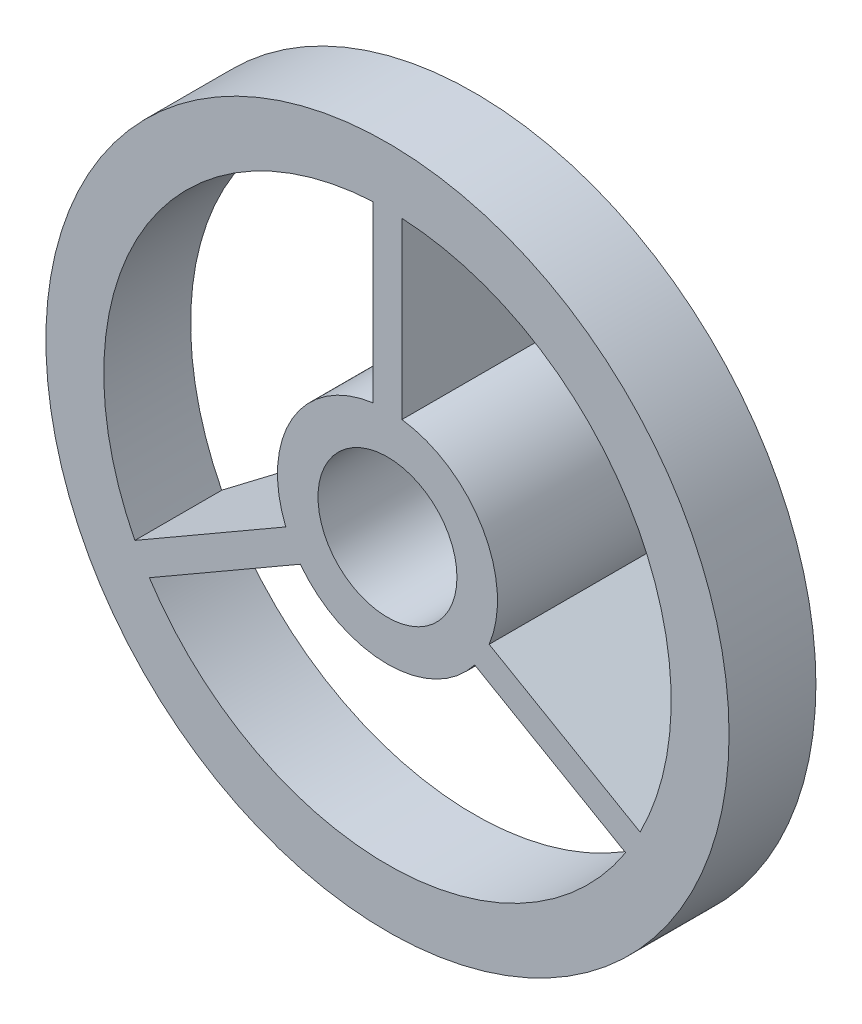
ISO-10303-21;
HEADER;
FILE_DESCRIPTION(('STEP AP214'),'2;1');
FILE_NAME('part.step','',(''),(''),'','','');
FILE_SCHEMA(('AUTOMOTIVE_DESIGN { 1 0 10303 214 1 1 1 1 }'));
ENDSEC;
DATA;
#1=APPLICATION_CONTEXT('core data for automotive mechanical design processes');
#2=APPLICATION_PROTOCOL_DEFINITION('international standard','automotive_design',2000,#1);
#3=PRODUCT_CONTEXT('',#1,'mechanical');
#4=PRODUCT('Part','Part','',(#3));
#5=PRODUCT_RELATED_PRODUCT_CATEGORY('part','',(#4));
#6=PRODUCT_DEFINITION_FORMATION('','',#4);
#7=PRODUCT_DEFINITION_CONTEXT('part definition',#1,'design');
#8=PRODUCT_DEFINITION('design','',#6,#7);
#9=PRODUCT_DEFINITION_SHAPE('','',#8);
#10=(LENGTH_UNIT() NAMED_UNIT(*) SI_UNIT(.MILLI.,.METRE.));
#11=(NAMED_UNIT(*) PLANE_ANGLE_UNIT() SI_UNIT($,.RADIAN.));
#12=(NAMED_UNIT(*) SI_UNIT($,.STERADIAN.) SOLID_ANGLE_UNIT());
#13=UNCERTAINTY_MEASURE_WITH_UNIT(LENGTH_MEASURE(1.E-05),#10,'distance_accuracy_value','');
#14=(GEOMETRIC_REPRESENTATION_CONTEXT(3) GLOBAL_UNCERTAINTY_ASSIGNED_CONTEXT((#13)) GLOBAL_UNIT_ASSIGNED_CONTEXT((#10,
#11,#12)) REPRESENTATION_CONTEXT('',''));
#15=CARTESIAN_POINT('',(0.,0.,0.));
#16=DIRECTION('',(0.,0.,1.));
#17=DIRECTION('',(1.,0.,0.));
#18=AXIS2_PLACEMENT_3D('',#15,#16,#17);
#19=CARTESIAN_POINT('',(0.,0.,3.5));
#20=DIRECTION('',(0.,0.,-1.));
#21=DIRECTION('',(-1.,0.,0.));
#22=AXIS2_PLACEMENT_3D('',#19,#20,#21);
#23=CYLINDRICAL_SURFACE('',#22,1.9);
#24=DIRECTION('',(0.,0.,-1.));
#25=VECTOR('',#24,1.);
#26=CARTESIAN_POINT('',(1.75614223781987,-0.725234059145742,3.5));
#27=LINE('',#26,#25);
#28=CARTESIAN_POINT('',(1.75614223781987,-0.725234059145742,0.));
#29=VERTEX_POINT('',#28);
#30=CARTESIAN_POINT('',(1.75614223781987,-0.725234059145742,3.5));
#31=VERTEX_POINT('',#30);
#32=EDGE_CURVE('E198',#29,#31,#27,.F.);
#33=ORIENTED_EDGE('',*,*,#32,.F.);
#34=CARTESIAN_POINT('',(0.,0.,0.));
#35=DIRECTION('',(0.,0.,1.));
#36=DIRECTION('',(1.,0.,0.));
#37=AXIS2_PLACEMENT_3D('',#34,#35,#36);
#38=CIRCLE('',#37,1.9);
#39=CARTESIAN_POINT('',(0.25,1.88348082018374,0.));
#40=VERTEX_POINT('',#39);
#41=EDGE_CURVE('E287',#29,#40,#38,.T.);
#42=ORIENTED_EDGE('',*,*,#41,.T.);
#43=DIRECTION('',(0.,0.,-1.));
#44=VECTOR('',#43,1.);
#45=CARTESIAN_POINT('',(0.25,1.88348082018374,3.5));
#46=LINE('',#45,#44);
#47=CARTESIAN_POINT('',(0.25,1.88348082018374,3.5));
#48=VERTEX_POINT('',#47);
#49=EDGE_CURVE('E301',#40,#48,#46,.F.);
#50=ORIENTED_EDGE('',*,*,#49,.T.);
#51=CARTESIAN_POINT('',(0.,0.,3.5));
#52=DIRECTION('',(0.,0.,1.));
#53=DIRECTION('',(1.,0.,0.));
#54=AXIS2_PLACEMENT_3D('',#51,#52,#53);
#55=CIRCLE('',#54,1.9);
#56=EDGE_CURVE('E295',#31,#48,#55,.T.);
#57=ORIENTED_EDGE('',*,*,#56,.F.);
#58=EDGE_LOOP('',(#33,#42,#50,#57));
#59=FACE_BOUND('',#58,.T.);
#60=ADVANCED_FACE('F37',(#59),#23,.T.);
#61=CARTESIAN_POINT('',(0.,0.,2.));
#62=DIRECTION('',(0.,0.,1.));
#63=DIRECTION('',(1.,0.,0.));
#64=AXIS2_PLACEMENT_3D('',#61,#62,#63);
#65=PLANE('',#64);
#66=CARTESIAN_POINT('',(0.,0.,2.));
#67=DIRECTION('',(0.,0.,1.));
#68=DIRECTION('',(1.,0.,0.));
#69=AXIS2_PLACEMENT_3D('',#66,#67,#68);
#70=CIRCLE('',#69,5.9);
#71=CARTESIAN_POINT('',(5.9,0.,2.));
#72=VERTEX_POINT('',#71);
#73=EDGE_CURVE('E248',#72,#72,#70,.T.);
#74=ORIENTED_EDGE('',*,*,#73,.F.);
#75=EDGE_LOOP('',(#74));
#76=FACE_BOUND('',#75,.T.);
#77=CARTESIAN_POINT('',(0.,0.,2.));
#78=DIRECTION('',(0.,0.,1.));
#79=DIRECTION('',(1.,0.,0.));
#80=AXIS2_PLACEMENT_3D('',#77,#78,#79);
#81=CIRCLE('',#80,4.9);
#82=CARTESIAN_POINT('',(-4.11299775837599,-2.66331549756954,2.));
#83=VERTEX_POINT('',#82);
#84=CARTESIAN_POINT('',(4.11299775837602,-2.66331549756949,2.));
#85=VERTEX_POINT('',#84);
#86=EDGE_CURVE('E243',#83,#85,#81,.T.);
#87=ORIENTED_EDGE('',*,*,#86,.T.);
#88=DIRECTION('',(0.866025403784443,-0.499999999999992,0.));
#89=VECTOR('',#88,1.);
#90=CARTESIAN_POINT('',(-0.124999999999998,-0.216506350946111,2.));
#91=LINE('',#90,#89);
#92=CARTESIAN_POINT('',(4.11852447854377,-2.66650635094607,2.));
#93=VERTEX_POINT('',#92);
#94=EDGE_CURVE('E203',#85,#93,#91,.T.);
#95=ORIENTED_EDGE('',*,*,#94,.T.);
#96=DIRECTION('',(0.499999999999992,0.866025403784443,0.));
#97=VECTOR('',#96,1.);
#98=CARTESIAN_POINT('',(4.11852447854377,-2.66650635094607,2.));
#99=LINE('',#98,#97);
#100=CARTESIAN_POINT('',(4.36852447854377,-2.23349364905385,2.));
#101=VERTEX_POINT('',#100);
#102=EDGE_CURVE('E52',#93,#101,#99,.T.);
#103=ORIENTED_EDGE('',*,*,#102,.T.);
#104=DIRECTION('',(0.866025403784443,-0.499999999999992,0.));
#105=VECTOR('',#104,1.);
#106=CARTESIAN_POINT('',(0.124999999999998,0.216506350946111,2.));
#107=LINE('',#106,#105);
#108=CARTESIAN_POINT('',(4.36299775837602,-2.23030279567726,2.));
#109=VERTEX_POINT('',#108);
#110=EDGE_CURVE('E196',#109,#101,#107,.T.);
#111=ORIENTED_EDGE('',*,*,#110,.F.);
#112=CARTESIAN_POINT('',(0.25,4.89361829324683,2.));
#113=VERTEX_POINT('',#112);
#114=EDGE_CURVE('E244',#109,#113,#81,.T.);
#115=ORIENTED_EDGE('',*,*,#114,.T.);
#116=DIRECTION('',(0.,-1.,0.));
#117=VECTOR('',#116,1.);
#118=CARTESIAN_POINT('',(0.25,0.,2.));
#119=LINE('',#118,#117);
#120=CARTESIAN_POINT('',(0.25,4.9,2.));
#121=VERTEX_POINT('',#120);
#122=EDGE_CURVE('E258',#121,#113,#119,.T.);
#123=ORIENTED_EDGE('',*,*,#122,.F.);
#124=DIRECTION('',(-1.,0.,0.));
#125=VECTOR('',#124,1.);
#126=CARTESIAN_POINT('',(0.25,4.9,2.));
#127=LINE('',#126,#125);
#128=CARTESIAN_POINT('',(-0.25,4.9,2.));
#129=VERTEX_POINT('',#128);
#130=EDGE_CURVE('E273',#121,#129,#127,.T.);
#131=ORIENTED_EDGE('',*,*,#130,.T.);
#132=DIRECTION('',(0.,-1.,0.));
#133=VECTOR('',#132,1.);
#134=CARTESIAN_POINT('',(-0.25,0.,2.));
#135=LINE('',#134,#133);
#136=CARTESIAN_POINT('',(-0.25,4.89361829324683,2.));
#137=VERTEX_POINT('',#136);
#138=EDGE_CURVE('E261',#129,#137,#135,.T.);
#139=ORIENTED_EDGE('',*,*,#138,.T.);
#140=CARTESIAN_POINT('',(-4.36299775837599,-2.23030279567732,2.));
#141=VERTEX_POINT('',#140);
#142=EDGE_CURVE('E239',#137,#141,#81,.T.);
#143=ORIENTED_EDGE('',*,*,#142,.T.);
#144=DIRECTION('',(-0.866025403784436,-0.500000000000004,0.));
#145=VECTOR('',#144,1.);
#146=CARTESIAN_POINT('',(-0.125000000000001,0.216506350946109,2.));
#147=LINE('',#146,#145);
#148=CARTESIAN_POINT('',(-4.36852447854374,-2.23349364905391,2.));
#149=VERTEX_POINT('',#148);
#150=EDGE_CURVE('E233',#141,#149,#147,.T.);
#151=ORIENTED_EDGE('',*,*,#150,.T.);
#152=DIRECTION('',(0.500000000000004,-0.866025403784436,0.));
#153=VECTOR('',#152,1.);
#154=CARTESIAN_POINT('',(-4.36852447854374,-2.23349364905391,2.));
#155=LINE('',#154,#153);
#156=CARTESIAN_POINT('',(-4.11852447854374,-2.66650635094613,2.));
#157=VERTEX_POINT('',#156);
#158=EDGE_CURVE('E216',#149,#157,#155,.T.);
#159=ORIENTED_EDGE('',*,*,#158,.T.);
#160=DIRECTION('',(-0.866025403784436,-0.500000000000004,0.));
#161=VECTOR('',#160,1.);
#162=CARTESIAN_POINT('',(0.125000000000001,-0.216506350946109,2.));
#163=LINE('',#162,#161);
#164=EDGE_CURVE('E227',#83,#157,#163,.T.);
#165=ORIENTED_EDGE('',*,*,#164,.F.);
#166=EDGE_LOOP('',(#87,#95,#103,#111,#115,#123,#131,#139,#143,#151,#159,#165));
#167=FACE_BOUND('',#166,.T.);
#168=ADVANCED_FACE('F332',(#76,#167),#65,.F.);
#169=CARTESIAN_POINT('',(0.,0.,2.));
#170=DIRECTION('',(0.,0.,1.));
#171=DIRECTION('',(1.,0.,0.));
#172=AXIS2_PLACEMENT_3D('',#169,#170,#171);
#173=CYLINDRICAL_SURFACE('',#172,4.9);
#174=DIRECTION('',(0.,0.,1.));
#175=VECTOR('',#174,1.);
#176=CARTESIAN_POINT('',(4.36299775837602,-2.23030279567726,2.));
#177=LINE('',#176,#175);
#178=CARTESIAN_POINT('',(4.36299775837602,-2.23030279567726,3.5));
#179=VERTEX_POINT('',#178);
#180=EDGE_CURVE('E181',#179,#109,#177,.F.);
#181=ORIENTED_EDGE('',*,*,#180,.F.);
#182=CARTESIAN_POINT('',(0.,0.,3.5));
#183=DIRECTION('',(0.,0.,1.));
#184=DIRECTION('',(1.,0.,0.));
#185=AXIS2_PLACEMENT_3D('',#182,#183,#184);
#186=CIRCLE('',#185,4.9);
#187=CARTESIAN_POINT('',(0.25,4.89361829324683,3.5));
#188=VERTEX_POINT('',#187);
#189=EDGE_CURVE('E238',#179,#188,#186,.T.);
#190=ORIENTED_EDGE('',*,*,#189,.T.);
#191=DIRECTION('',(0.,0.,1.));
#192=VECTOR('',#191,1.);
#193=CARTESIAN_POINT('',(0.25,4.89361829324683,2.));
#194=LINE('',#193,#192);
#195=EDGE_CURVE('E255',#113,#188,#194,.T.);
#196=ORIENTED_EDGE('',*,*,#195,.F.);
#197=ORIENTED_EDGE('',*,*,#114,.F.);
#198=EDGE_LOOP('',(#181,#190,#196,#197));
#199=FACE_BOUND('',#198,.T.);
#200=ADVANCED_FACE('F323',(#199),#173,.F.);
#201=CARTESIAN_POINT('',(-1.50614223781986,-1.15824676103798,0.));
#202=VERTEX_POINT('',#201);
#203=CARTESIAN_POINT('',(1.50614223781988,-1.15824676103796,0.));
#204=VERTEX_POINT('',#203);
#205=EDGE_CURVE('E298',#202,#204,#38,.T.);
#206=ORIENTED_EDGE('',*,*,#205,.T.);
#207=DIRECTION('',(0.,0.,-1.));
#208=VECTOR('',#207,1.);
#209=CARTESIAN_POINT('',(1.50614223781988,-1.15824676103796,3.5));
#210=LINE('',#209,#208);
#211=CARTESIAN_POINT('',(1.50614223781988,-1.15824676103796,3.5));
#212=VERTEX_POINT('',#211);
#213=EDGE_CURVE('E168',#204,#212,#210,.F.);
#214=ORIENTED_EDGE('',*,*,#213,.T.);
#215=CARTESIAN_POINT('',(-1.50614223781986,-1.15824676103798,3.5));
#216=VERTEX_POINT('',#215);
#217=EDGE_CURVE('E294',#216,#212,#55,.T.);
#218=ORIENTED_EDGE('',*,*,#217,.F.);
#219=DIRECTION('',(0.,0.,-1.));
#220=VECTOR('',#219,1.);
#221=CARTESIAN_POINT('',(-1.50614223781986,-1.15824676103798,3.5));
#222=LINE('',#221,#220);
#223=EDGE_CURVE('E230',#202,#216,#222,.F.);
#224=ORIENTED_EDGE('',*,*,#223,.F.);
#225=EDGE_LOOP('',(#206,#214,#218,#224));
#226=FACE_BOUND('',#225,.T.);
#227=ADVANCED_FACE('F337',(#226),#23,.T.);
#228=CARTESIAN_POINT('',(-4.11299775837599,-2.66331549756954,3.5));
#229=VERTEX_POINT('',#228);
#230=CARTESIAN_POINT('',(4.11299775837602,-2.66331549756949,3.5));
#231=VERTEX_POINT('',#230);
#232=EDGE_CURVE('E247',#229,#231,#186,.T.);
#233=ORIENTED_EDGE('',*,*,#232,.T.);
#234=DIRECTION('',(0.,0.,1.));
#235=VECTOR('',#234,1.);
#236=CARTESIAN_POINT('',(4.11299775837602,-2.66331549756949,2.));
#237=LINE('',#236,#235);
#238=EDGE_CURVE('E201',#231,#85,#237,.F.);
#239=ORIENTED_EDGE('',*,*,#238,.T.);
#240=ORIENTED_EDGE('',*,*,#86,.F.);
#241=DIRECTION('',(0.,0.,1.));
#242=VECTOR('',#241,1.);
#243=CARTESIAN_POINT('',(-4.11299775837599,-2.66331549756954,2.));
#244=LINE('',#243,#242);
#245=EDGE_CURVE('E45',#229,#83,#244,.F.);
#246=ORIENTED_EDGE('',*,*,#245,.F.);
#247=EDGE_LOOP('',(#233,#239,#240,#246));
#248=FACE_BOUND('',#247,.T.);
#249=ADVANCED_FACE('F312',(#248),#173,.F.);
#250=CARTESIAN_POINT('',(0.25,0.,0.));
#251=DIRECTION('',(1.,0.,0.));
#252=DIRECTION('',(0.,0.,-1.));
#253=AXIS2_PLACEMENT_3D('',#250,#251,#252);
#254=PLANE('',#253);
#255=DIRECTION('',(0.,0.832050294337844,0.554700196225229));
#256=VECTOR('',#255,1.);
#257=CARTESIAN_POINT('',(0.25,1.9,0.));
#258=LINE('',#257,#256);
#259=CARTESIAN_POINT('',(0.25,1.9,0.));
#260=VERTEX_POINT('',#259);
#261=EDGE_CURVE('E270',#260,#121,#258,.T.);
#262=ORIENTED_EDGE('',*,*,#261,.T.);
#263=ORIENTED_EDGE('',*,*,#122,.T.);
#264=ORIENTED_EDGE('',*,*,#195,.T.);
#265=DIRECTION('',(0.,-1.,0.));
#266=VECTOR('',#265,1.);
#267=CARTESIAN_POINT('',(0.25,1.9,3.5));
#268=LINE('',#267,#266);
#269=EDGE_CURVE('E264',#188,#48,#268,.T.);
#270=ORIENTED_EDGE('',*,*,#269,.T.);
#271=ORIENTED_EDGE('',*,*,#49,.F.);
#272=DIRECTION('',(0.,1.,0.));
#273=VECTOR('',#272,1.);
#274=CARTESIAN_POINT('',(0.25,1.7,0.));
#275=LINE('',#274,#273);
#276=EDGE_CURVE('E267',#40,#260,#275,.T.);
#277=ORIENTED_EDGE('',*,*,#276,.T.);
#278=EDGE_LOOP('',(#262,#263,#264,#270,#271,#277));
#279=FACE_BOUND('',#278,.T.);
#280=ADVANCED_FACE('F328',(#279),#254,.T.);
#281=CARTESIAN_POINT('',(-0.25,0.,0.));
#282=DIRECTION('',(1.,0.,0.));
#283=DIRECTION('',(0.,0.,-1.));
#284=AXIS2_PLACEMENT_3D('',#281,#282,#283);
#285=PLANE('',#284);
#286=ORIENTED_EDGE('',*,*,#138,.F.);
#287=DIRECTION('',(0.,0.832050294337844,0.554700196225229));
#288=VECTOR('',#287,1.);
#289=CARTESIAN_POINT('',(-0.25,1.9,0.));
#290=LINE('',#289,#288);
#291=CARTESIAN_POINT('',(-0.25,1.9,0.));
#292=VERTEX_POINT('',#291);
#293=EDGE_CURVE('E276',#292,#129,#290,.T.);
#294=ORIENTED_EDGE('',*,*,#293,.F.);
#295=DIRECTION('',(0.,1.,0.));
#296=VECTOR('',#295,1.);
#297=CARTESIAN_POINT('',(-0.25,1.7,0.));
#298=LINE('',#297,#296);
#299=CARTESIAN_POINT('',(-0.25,1.88348082018374,0.));
#300=VERTEX_POINT('',#299);
#301=EDGE_CURVE('E263',#300,#292,#298,.T.);
#302=ORIENTED_EDGE('',*,*,#301,.F.);
#303=DIRECTION('',(0.,0.,-1.));
#304=VECTOR('',#303,1.);
#305=CARTESIAN_POINT('',(-0.25,1.88348082018374,3.5));
#306=LINE('',#305,#304);
#307=CARTESIAN_POINT('',(-0.25,1.88348082018374,3.5));
#308=VERTEX_POINT('',#307);
#309=EDGE_CURVE('E293',#300,#308,#306,.F.);
#310=ORIENTED_EDGE('',*,*,#309,.T.);
#311=DIRECTION('',(0.,-1.,0.));
#312=VECTOR('',#311,1.);
#313=CARTESIAN_POINT('',(-0.25,4.9,3.5));
#314=LINE('',#313,#312);
#315=CARTESIAN_POINT('',(-0.25,4.89361829324683,3.5));
#316=VERTEX_POINT('',#315);
#317=EDGE_CURVE('E268',#316,#308,#314,.T.);
#318=ORIENTED_EDGE('',*,*,#317,.F.);
#319=DIRECTION('',(0.,0.,1.));
#320=VECTOR('',#319,1.);
#321=CARTESIAN_POINT('',(-0.25,4.89361829324683,2.));
#322=LINE('',#321,#320);
#323=EDGE_CURVE('E251',#137,#316,#322,.T.);
#324=ORIENTED_EDGE('',*,*,#323,.F.);
#325=EDGE_LOOP('',(#286,#294,#302,#310,#318,#324));
#326=FACE_BOUND('',#325,.T.);
#327=ADVANCED_FACE('F359',(#326),#285,.F.);
#328=CARTESIAN_POINT('',(0.,0.,3.5));
#329=DIRECTION('',(0.,0.,1.));
#330=DIRECTION('',(1.,0.,0.));
#331=AXIS2_PLACEMENT_3D('',#328,#329,#330);
#332=PLANE('',#331);
#333=DIRECTION('',(-0.866025403784443,0.499999999999992,0.));
#334=VECTOR('',#333,1.);
#335=CARTESIAN_POINT('',(4.36852447854377,-2.23349364905385,3.5));
#336=LINE('',#335,#334);
#337=EDGE_CURVE('E191',#179,#31,#336,.T.);
#338=ORIENTED_EDGE('',*,*,#337,.T.);
#339=ORIENTED_EDGE('',*,*,#56,.T.);
#340=ORIENTED_EDGE('',*,*,#269,.F.);
#341=ORIENTED_EDGE('',*,*,#189,.F.);
#342=EDGE_LOOP('',(#338,#339,#340,#341));
#343=FACE_BOUND('',#342,.T.);
#344=ORIENTED_EDGE('',*,*,#217,.T.);
#345=DIRECTION('',(-0.866025403784443,0.499999999999992,0.));
#346=VECTOR('',#345,1.);
#347=CARTESIAN_POINT('',(1.52044826719044,-1.1665063509461,3.5));
#348=LINE('',#347,#346);
#349=EDGE_CURVE('E171',#231,#212,#348,.T.);
#350=ORIENTED_EDGE('',*,*,#349,.F.);
#351=ORIENTED_EDGE('',*,*,#232,.F.);
#352=DIRECTION('',(0.866025403784436,0.500000000000004,0.));
#353=VECTOR('',#352,1.);
#354=CARTESIAN_POINT('',(-4.11852447854374,-2.66650635094613,3.5));
#355=LINE('',#354,#353);
#356=EDGE_CURVE('E211',#229,#216,#355,.T.);
#357=ORIENTED_EDGE('',*,*,#356,.T.);
#358=EDGE_LOOP('',(#344,#350,#351,#357));
#359=FACE_BOUND('',#358,.T.);
#360=CARTESIAN_POINT('',(-1.75614223781986,-0.725234059145766,3.5));
#361=VERTEX_POINT('',#360);
#362=EDGE_CURVE('E290',#308,#361,#55,.T.);
#363=ORIENTED_EDGE('',*,*,#362,.T.);
#364=DIRECTION('',(0.866025403784436,0.500000000000004,0.));
#365=VECTOR('',#364,1.);
#366=CARTESIAN_POINT('',(-1.77044826719043,-0.733493649053898,3.5));
#367=LINE('',#366,#365);
#368=CARTESIAN_POINT('',(-4.36299775837599,-2.23030279567732,3.5));
#369=VERTEX_POINT('',#368);
#370=EDGE_CURVE('E207',#369,#361,#367,.T.);
#371=ORIENTED_EDGE('',*,*,#370,.F.);
#372=EDGE_CURVE('E245',#316,#369,#186,.T.);
#373=ORIENTED_EDGE('',*,*,#372,.F.);
#374=ORIENTED_EDGE('',*,*,#317,.T.);
#375=EDGE_LOOP('',(#363,#371,#373,#374));
#376=FACE_BOUND('',#375,.T.);
#377=CARTESIAN_POINT('',(0.,0.,3.5));
#378=DIRECTION('',(0.,0.,1.));
#379=DIRECTION('',(1.,0.,0.));
#380=AXIS2_PLACEMENT_3D('',#377,#378,#379);
#381=CIRCLE('',#380,5.9);
#382=CARTESIAN_POINT('',(5.9,0.,3.5));
#383=VERTEX_POINT('',#382);
#384=EDGE_CURVE('E242',#383,#383,#381,.T.);
#385=ORIENTED_EDGE('',*,*,#384,.T.);
#386=EDGE_LOOP('',(#385));
#387=FACE_BOUND('',#386,.T.);
#388=CARTESIAN_POINT('',(0.,0.,3.5));
#389=DIRECTION('',(0.,0.,1.));
#390=DIRECTION('',(1.,0.,0.));
#391=AXIS2_PLACEMENT_3D('',#388,#389,#390);
#392=CIRCLE('',#391,1.2);
#393=CARTESIAN_POINT('',(1.2,0.,3.5));
#394=VERTEX_POINT('',#393);
#395=EDGE_CURVE('E284',#394,#394,#392,.T.);
#396=ORIENTED_EDGE('',*,*,#395,.F.);
#397=EDGE_LOOP('',(#396));
#398=FACE_BOUND('',#397,.T.);
#399=ADVANCED_FACE('F318',(#343,#359,#376,#387,#398),#332,.T.);
#400=CARTESIAN_POINT('',(0.,0.,0.));
#401=DIRECTION('',(0.,0.,1.));
#402=DIRECTION('',(1.,0.,0.));
#403=AXIS2_PLACEMENT_3D('',#400,#401,#402);
#404=PLANE('',#403);
#405=DIRECTION('',(0.866025403784443,-0.499999999999992,0.));
#406=VECTOR('',#405,1.);
#407=CARTESIAN_POINT('',(1.59724318643355,-0.633493649053875,0.));
#408=LINE('',#407,#406);
#409=CARTESIAN_POINT('',(1.77044826719044,-0.733493649053874,0.));
#410=VERTEX_POINT('',#409);
#411=EDGE_CURVE('E179',#29,#410,#408,.T.);
#412=ORIENTED_EDGE('',*,*,#411,.T.);
#413=DIRECTION('',(0.499999999999992,0.866025403784443,0.));
#414=VECTOR('',#413,1.);
#415=CARTESIAN_POINT('',(1.52044826719044,-1.1665063509461,0.));
#416=LINE('',#415,#414);
#417=CARTESIAN_POINT('',(1.52044826719044,-1.1665063509461,0.));
#418=VERTEX_POINT('',#417);
#419=EDGE_CURVE('E174',#418,#410,#416,.T.);
#420=ORIENTED_EDGE('',*,*,#419,.F.);
#421=DIRECTION('',(0.866025403784443,-0.499999999999992,0.));
#422=VECTOR('',#421,1.);
#423=CARTESIAN_POINT('',(1.34724318643356,-1.0665063509461,0.));
#424=LINE('',#423,#422);
#425=EDGE_CURVE('E162',#204,#418,#424,.T.);
#426=ORIENTED_EDGE('',*,*,#425,.F.);
#427=ORIENTED_EDGE('',*,*,#205,.F.);
#428=DIRECTION('',(-0.866025403784436,-0.500000000000004,0.));
#429=VECTOR('',#428,1.);
#430=CARTESIAN_POINT('',(-1.34724318643354,-1.06650635094612,0.));
#431=LINE('',#430,#429);
#432=CARTESIAN_POINT('',(-1.52044826719043,-1.16650635094612,0.));
#433=VERTEX_POINT('',#432);
#434=EDGE_CURVE('E206',#202,#433,#431,.T.);
#435=ORIENTED_EDGE('',*,*,#434,.T.);
#436=DIRECTION('',(0.500000000000004,-0.866025403784436,0.));
#437=VECTOR('',#436,1.);
#438=CARTESIAN_POINT('',(-1.77044826719043,-0.733493649053898,0.));
#439=LINE('',#438,#437);
#440=CARTESIAN_POINT('',(-1.77044826719043,-0.733493649053898,0.));
#441=VERTEX_POINT('',#440);
#442=EDGE_CURVE('E225',#441,#433,#439,.T.);
#443=ORIENTED_EDGE('',*,*,#442,.F.);
#444=DIRECTION('',(-0.866025403784436,-0.500000000000004,0.));
#445=VECTOR('',#444,1.);
#446=CARTESIAN_POINT('',(-1.59724318643354,-0.633493649053898,0.));
#447=LINE('',#446,#445);
#448=CARTESIAN_POINT('',(-1.75614223781986,-0.725234059145766,0.));
#449=VERTEX_POINT('',#448);
#450=EDGE_CURVE('E210',#449,#441,#447,.T.);
#451=ORIENTED_EDGE('',*,*,#450,.F.);
#452=EDGE_CURVE('E296',#300,#449,#38,.T.);
#453=ORIENTED_EDGE('',*,*,#452,.F.);
#454=ORIENTED_EDGE('',*,*,#301,.T.);
#455=DIRECTION('',(-1.,0.,0.));
#456=VECTOR('',#455,1.);
#457=CARTESIAN_POINT('',(0.25,1.9,0.));
#458=LINE('',#457,#456);
#459=EDGE_CURVE('E281',#260,#292,#458,.T.);
#460=ORIENTED_EDGE('',*,*,#459,.F.);
#461=ORIENTED_EDGE('',*,*,#276,.F.);
#462=ORIENTED_EDGE('',*,*,#41,.F.);
#463=EDGE_LOOP('',(#412,#420,#426,#427,#435,#443,#451,#453,#454,#460,#461,#462));
#464=FACE_BOUND('',#463,.T.);
#465=CARTESIAN_POINT('',(0.,0.,0.));
#466=DIRECTION('',(0.,0.,1.));
#467=DIRECTION('',(1.,0.,0.));
#468=AXIS2_PLACEMENT_3D('',#465,#466,#467);
#469=CIRCLE('',#468,1.2);
#470=CARTESIAN_POINT('',(1.2,0.,0.));
#471=VERTEX_POINT('',#470);
#472=EDGE_CURVE('E283',#471,#471,#469,.T.);
#473=ORIENTED_EDGE('',*,*,#472,.T.);
#474=EDGE_LOOP('',(#473));
#475=FACE_BOUND('',#474,.T.);
#476=ADVANCED_FACE('F175',(#464,#475),#404,.F.);
#477=ORIENTED_EDGE('',*,*,#452,.T.);
#478=DIRECTION('',(0.,0.,-1.));
#479=VECTOR('',#478,1.);
#480=CARTESIAN_POINT('',(-1.75614223781986,-0.725234059145767,3.5));
#481=LINE('',#480,#479);
#482=EDGE_CURVE('E236',#449,#361,#481,.F.);
#483=ORIENTED_EDGE('',*,*,#482,.T.);
#484=ORIENTED_EDGE('',*,*,#362,.F.);
#485=ORIENTED_EDGE('',*,*,#309,.F.);
#486=EDGE_LOOP('',(#477,#483,#484,#485));
#487=FACE_BOUND('',#486,.T.);
#488=ADVANCED_FACE('F39',(#487),#23,.T.);
#489=CARTESIAN_POINT('',(0.,0.,3.5));
#490=DIRECTION('',(0.,0.,-1.));
#491=DIRECTION('',(-1.,0.,0.));
#492=AXIS2_PLACEMENT_3D('',#489,#490,#491);
#493=CYLINDRICAL_SURFACE('',#492,1.2);
#494=ORIENTED_EDGE('',*,*,#395,.T.);
#495=EDGE_LOOP('',(#494));
#496=FACE_BOUND('',#495,.T.);
#497=ORIENTED_EDGE('',*,*,#472,.F.);
#498=EDGE_LOOP('',(#497));
#499=FACE_BOUND('',#498,.T.);
#500=ADVANCED_FACE('F377',(#496,#499),#493,.F.);
#501=CARTESIAN_POINT('',(0.25,1.9,0.));
#502=DIRECTION('',(0.,-0.554700196225229,0.832050294337844));
#503=DIRECTION('',(0.,-0.832050294337844,-0.554700196225229));
#504=AXIS2_PLACEMENT_3D('',#501,#502,#503);
#505=PLANE('',#504);
#506=ORIENTED_EDGE('',*,*,#293,.T.);
#507=ORIENTED_EDGE('',*,*,#130,.F.);
#508=ORIENTED_EDGE('',*,*,#261,.F.);
#509=ORIENTED_EDGE('',*,*,#459,.T.);
#510=EDGE_LOOP('',(#506,#507,#508,#509));
#511=FACE_BOUND('',#510,.T.);
#512=ADVANCED_FACE('F364',(#511),#505,.F.);
#513=ORIENTED_EDGE('',*,*,#372,.T.);
#514=DIRECTION('',(0.,0.,1.));
#515=VECTOR('',#514,1.);
#516=CARTESIAN_POINT('',(-4.36299775837599,-2.23030279567732,2.));
#517=LINE('',#516,#515);
#518=EDGE_CURVE('E11',#369,#141,#517,.F.);
#519=ORIENTED_EDGE('',*,*,#518,.T.);
#520=ORIENTED_EDGE('',*,*,#142,.F.);
#521=ORIENTED_EDGE('',*,*,#323,.T.);
#522=EDGE_LOOP('',(#513,#519,#520,#521));
#523=FACE_BOUND('',#522,.T.);
#524=ADVANCED_FACE('F367',(#523),#173,.F.);
#525=CARTESIAN_POINT('',(0.,0.,2.));
#526=DIRECTION('',(0.,0.,1.));
#527=DIRECTION('',(1.,0.,0.));
#528=AXIS2_PLACEMENT_3D('',#525,#526,#527);
#529=CYLINDRICAL_SURFACE('',#528,5.9);
#530=ORIENTED_EDGE('',*,*,#73,.T.);
#531=EDGE_LOOP('',(#530));
#532=FACE_BOUND('',#531,.T.);
#533=ORIENTED_EDGE('',*,*,#384,.F.);
#534=EDGE_LOOP('',(#533));
#535=FACE_BOUND('',#534,.T.);
#536=ADVANCED_FACE('F369',(#532,#535),#529,.T.);
#537=CARTESIAN_POINT('',(-0.125000000000001,0.216506350946109,0.));
#538=DIRECTION('',(-0.500000000000004,0.866025403784436,0.));
#539=DIRECTION('',(0.,0.,-1.));
#540=AXIS2_PLACEMENT_3D('',#537,#538,#539);
#541=PLANE('',#540);
#542=ORIENTED_EDGE('',*,*,#482,.F.);
#543=ORIENTED_EDGE('',*,*,#450,.T.);
#544=DIRECTION('',(-0.72057669212289,-0.416025147168925,0.554700196225229));
#545=VECTOR('',#544,1.);
#546=CARTESIAN_POINT('',(-1.77044826719043,-0.733493649053898,0.));
#547=LINE('',#546,#545);
#548=EDGE_CURVE('E213',#441,#149,#547,.T.);
#549=ORIENTED_EDGE('',*,*,#548,.T.);
#550=ORIENTED_EDGE('',*,*,#150,.F.);
#551=ORIENTED_EDGE('',*,*,#518,.F.);
#552=ORIENTED_EDGE('',*,*,#370,.T.);
#553=EDGE_LOOP('',(#542,#543,#549,#550,#551,#552));
#554=FACE_BOUND('',#553,.T.);
#555=ADVANCED_FACE('F347',(#554),#541,.T.);
#556=CARTESIAN_POINT('',(0.125000000000001,-0.216506350946109,0.));
#557=DIRECTION('',(-0.500000000000004,0.866025403784436,0.));
#558=DIRECTION('',(0.,0.,-1.));
#559=AXIS2_PLACEMENT_3D('',#556,#557,#558);
#560=PLANE('',#559);
#561=ORIENTED_EDGE('',*,*,#434,.F.);
#562=ORIENTED_EDGE('',*,*,#223,.T.);
#563=ORIENTED_EDGE('',*,*,#356,.F.);
#564=ORIENTED_EDGE('',*,*,#245,.T.);
#565=ORIENTED_EDGE('',*,*,#164,.T.);
#566=DIRECTION('',(-0.72057669212289,-0.416025147168925,0.554700196225229));
#567=VECTOR('',#566,1.);
#568=CARTESIAN_POINT('',(-1.52044826719043,-1.16650635094612,0.));
#569=LINE('',#568,#567);
#570=EDGE_CURVE('E219',#433,#157,#569,.T.);
#571=ORIENTED_EDGE('',*,*,#570,.F.);
#572=EDGE_LOOP('',(#561,#562,#563,#564,#565,#571));
#573=FACE_BOUND('',#572,.T.);
#574=ADVANCED_FACE('F307',(#573),#560,.F.);
#575=CARTESIAN_POINT('',(-1.77044826719043,-0.733493649053898,0.));
#576=DIRECTION('',(0.48038446141526,0.277350098112617,0.832050294337844));
#577=DIRECTION('',(0.866025403784439,0.,-0.499999999999999));
#578=AXIS2_PLACEMENT_3D('',#575,#576,#577);
#579=PLANE('',#578);
#580=ORIENTED_EDGE('',*,*,#570,.T.);
#581=ORIENTED_EDGE('',*,*,#158,.F.);
#582=ORIENTED_EDGE('',*,*,#548,.F.);
#583=ORIENTED_EDGE('',*,*,#442,.T.);
#584=EDGE_LOOP('',(#580,#581,#582,#583));
#585=FACE_BOUND('',#584,.T.);
#586=ADVANCED_FACE('F340',(#585),#579,.F.);
#587=CARTESIAN_POINT('',(-0.124999999999998,-0.216506350946111,0.));
#588=DIRECTION('',(-0.499999999999992,-0.866025403784443,0.));
#589=DIRECTION('',(0.,0.,-1.));
#590=AXIS2_PLACEMENT_3D('',#587,#588,#589);
#591=PLANE('',#590);
#592=ORIENTED_EDGE('',*,*,#213,.F.);
#593=ORIENTED_EDGE('',*,*,#425,.T.);
#594=DIRECTION('',(0.720576692122896,-0.416025147168915,0.554700196225229));
#595=VECTOR('',#594,1.);
#596=CARTESIAN_POINT('',(1.52044826719044,-1.1665063509461,0.));
#597=LINE('',#596,#595);
#598=EDGE_CURVE('E166',#418,#93,#597,.T.);
#599=ORIENTED_EDGE('',*,*,#598,.T.);
#600=ORIENTED_EDGE('',*,*,#94,.F.);
#601=ORIENTED_EDGE('',*,*,#238,.F.);
#602=ORIENTED_EDGE('',*,*,#349,.T.);
#603=EDGE_LOOP('',(#592,#593,#599,#600,#601,#602));
#604=FACE_BOUND('',#603,.T.);
#605=ADVANCED_FACE('F164',(#604),#591,.T.);
#606=CARTESIAN_POINT('',(0.124999999999998,0.216506350946111,0.));
#607=DIRECTION('',(-0.499999999999992,-0.866025403784443,0.));
#608=DIRECTION('',(0.,0.,-1.));
#609=AXIS2_PLACEMENT_3D('',#606,#607,#608);
#610=PLANE('',#609);
#611=ORIENTED_EDGE('',*,*,#411,.F.);
#612=ORIENTED_EDGE('',*,*,#32,.T.);
#613=ORIENTED_EDGE('',*,*,#337,.F.);
#614=ORIENTED_EDGE('',*,*,#180,.T.);
#615=ORIENTED_EDGE('',*,*,#110,.T.);
#616=DIRECTION('',(0.720576692122896,-0.416025147168915,0.554700196225229));
#617=VECTOR('',#616,1.);
#618=CARTESIAN_POINT('',(1.77044826719044,-0.733493649053874,0.));
#619=LINE('',#618,#617);
#620=EDGE_CURVE('E189',#410,#101,#619,.T.);
#621=ORIENTED_EDGE('',*,*,#620,.F.);
#622=EDGE_LOOP('',(#611,#612,#613,#614,#615,#621));
#623=FACE_BOUND('',#622,.T.);
#624=ADVANCED_FACE('F334',(#623),#610,.F.);
#625=CARTESIAN_POINT('',(1.52044826719044,-1.1665063509461,0.));
#626=DIRECTION('',(-0.480384461415264,0.27735009811261,0.832050294337844));
#627=DIRECTION('',(0.866025403784437,0.,0.500000000000002));
#628=AXIS2_PLACEMENT_3D('',#625,#626,#627);
#629=PLANE('',#628);
#630=ORIENTED_EDGE('',*,*,#620,.T.);
#631=ORIENTED_EDGE('',*,*,#102,.F.);
#632=ORIENTED_EDGE('',*,*,#598,.F.);
#633=ORIENTED_EDGE('',*,*,#419,.T.);
#634=EDGE_LOOP('',(#630,#631,#632,#633));
#635=FACE_BOUND('',#634,.T.);
#636=ADVANCED_FACE('F183',(#635),#629,.F.);
#637=CLOSED_SHELL('',(#60,#168,#200,#227,#249,#280,#327,#399,#476,#488,#500,#512,#524,#536,#555,
#574,#586,#605,#624,#636));
#638=MANIFOLD_SOLID_BREP('B2',#637);
#639=ADVANCED_BREP_SHAPE_REPRESENTATION('',(#18,#638),#14);
#640=SHAPE_DEFINITION_REPRESENTATION(#9,#639);
ENDSEC;
END-ISO-10303-21;
